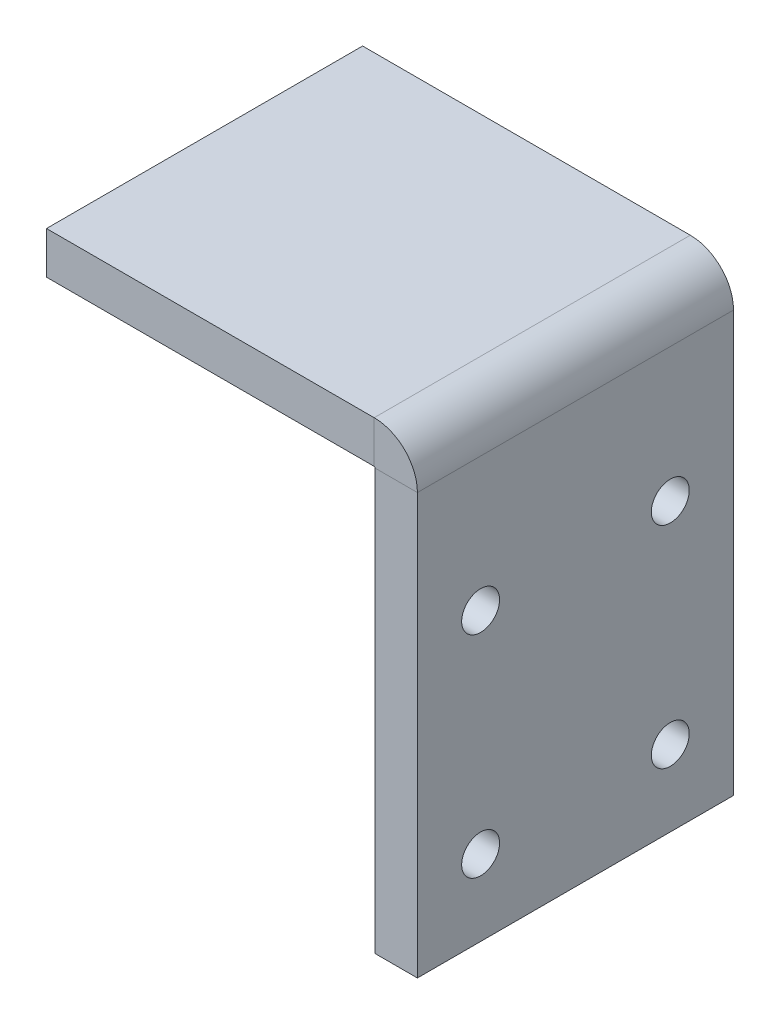
ISO-10303-21;
HEADER;
FILE_DESCRIPTION(('STEP AP214'),'2;1');
FILE_NAME('part.step','',(''),(''),'','','');
FILE_SCHEMA(('AUTOMOTIVE_DESIGN { 1 0 10303 214 1 1 1 1 }'));
ENDSEC;
DATA;
#1=APPLICATION_CONTEXT('core data for automotive mechanical design processes');
#2=APPLICATION_PROTOCOL_DEFINITION('international standard','automotive_design',2000,#1);
#3=PRODUCT_CONTEXT('',#1,'mechanical');
#4=PRODUCT('Part','Part','',(#3));
#5=PRODUCT_RELATED_PRODUCT_CATEGORY('part','',(#4));
#6=PRODUCT_DEFINITION_FORMATION('','',#4);
#7=PRODUCT_DEFINITION_CONTEXT('part definition',#1,'design');
#8=PRODUCT_DEFINITION('design','',#6,#7);
#9=PRODUCT_DEFINITION_SHAPE('','',#8);
#10=(LENGTH_UNIT() NAMED_UNIT(*) SI_UNIT(.MILLI.,.METRE.));
#11=(NAMED_UNIT(*) PLANE_ANGLE_UNIT() SI_UNIT($,.RADIAN.));
#12=(NAMED_UNIT(*) SI_UNIT($,.STERADIAN.) SOLID_ANGLE_UNIT());
#13=UNCERTAINTY_MEASURE_WITH_UNIT(LENGTH_MEASURE(1.E-05),#10,'distance_accuracy_value','');
#14=(GEOMETRIC_REPRESENTATION_CONTEXT(3) GLOBAL_UNCERTAINTY_ASSIGNED_CONTEXT((#13)) GLOBAL_UNIT_ASSIGNED_CONTEXT((#10,
#11,#12)) REPRESENTATION_CONTEXT('',''));
#15=CARTESIAN_POINT('',(0.,0.,0.));
#16=DIRECTION('',(0.,0.,1.));
#17=DIRECTION('',(1.,0.,0.));
#18=AXIS2_PLACEMENT_3D('',#15,#16,#17);
#19=CARTESIAN_POINT('',(-0.249999999999972,100.,75.));
#20=DIRECTION('',(0.,0.,1.));
#21=DIRECTION('',(1.,0.,0.));
#22=AXIS2_PLACEMENT_3D('',#19,#20,#21);
#23=PLANE('',#22);
#24=DIRECTION('',(0.,1.,0.));
#25=VECTOR('',#24,1.);
#26=CARTESIAN_POINT('',(-0.249999999999972,100.,75.));
#27=LINE('',#26,#25);
#28=CARTESIAN_POINT('',(-0.249999999999972,100.,75.));
#29=VERTEX_POINT('',#28);
#30=CARTESIAN_POINT('',(-0.250000000000028,110.,75.));
#31=VERTEX_POINT('',#30);
#32=EDGE_CURVE('E13',#29,#31,#27,.T.);
#33=ORIENTED_EDGE('',*,*,#32,.F.);
#34=CARTESIAN_POINT('',(-0.249999999999972,99.7499999999999,75.));
#35=DIRECTION('',(0.,0.,-1.));
#36=DIRECTION('',(-1.,0.,0.));
#37=AXIS2_PLACEMENT_3D('',#34,#35,#36);
#38=CIRCLE('',#37,0.25);
#39=CARTESIAN_POINT('',(0.,99.7499999999999,75.));
#40=VERTEX_POINT('',#39);
#41=EDGE_CURVE('E147',#40,#29,#38,.F.);
#42=ORIENTED_EDGE('',*,*,#41,.F.);
#43=DIRECTION('',(-1.,0.,0.));
#44=VECTOR('',#43,1.);
#45=CARTESIAN_POINT('',(10.,99.7499999999999,75.));
#46=LINE('',#45,#44);
#47=CARTESIAN_POINT('',(10.,99.7499999999999,75.));
#48=VERTEX_POINT('',#47);
#49=EDGE_CURVE('E58',#48,#40,#46,.T.);
#50=ORIENTED_EDGE('',*,*,#49,.F.);
#51=CARTESIAN_POINT('',(-0.249999999999972,99.7499999999999,75.));
#52=DIRECTION('',(0.,0.,1.));
#53=DIRECTION('',(1.,0.,0.));
#54=AXIS2_PLACEMENT_3D('',#51,#52,#53);
#55=CIRCLE('',#54,10.25);
#56=EDGE_CURVE('E140',#48,#31,#55,.T.);
#57=ORIENTED_EDGE('',*,*,#56,.T.);
#58=EDGE_LOOP('',(#33,#42,#50,#57));
#59=FACE_BOUND('',#58,.T.);
#60=ADVANCED_FACE('F50',(#59),#23,.T.);
#61=CARTESIAN_POINT('',(10.,99.7499999999999,75.));
#62=DIRECTION('',(0.,0.,1.));
#63=DIRECTION('',(1.,0.,0.));
#64=AXIS2_PLACEMENT_3D('',#61,#62,#63);
#65=PLANE('',#64);
#66=DIRECTION('',(-1.,0.,0.));
#67=VECTOR('',#66,1.);
#68=CARTESIAN_POINT('',(0.,100.,75.));
#69=LINE('',#68,#67);
#70=CARTESIAN_POINT('',(-78.,99.9999999999998,75.));
#71=VERTEX_POINT('',#70);
#72=EDGE_CURVE('E197',#29,#71,#69,.T.);
#73=ORIENTED_EDGE('',*,*,#72,.F.);
#74=ORIENTED_EDGE('',*,*,#32,.T.);
#75=DIRECTION('',(-1.,0.,0.));
#76=VECTOR('',#75,1.);
#77=CARTESIAN_POINT('',(0.,110.,75.));
#78=LINE('',#77,#76);
#79=CARTESIAN_POINT('',(-78.,110.,75.));
#80=VERTEX_POINT('',#79);
#81=EDGE_CURVE('E106',#31,#80,#78,.T.);
#82=ORIENTED_EDGE('',*,*,#81,.T.);
#83=DIRECTION('',(0.,1.,0.));
#84=VECTOR('',#83,1.);
#85=CARTESIAN_POINT('',(-78.,99.9999999999998,75.));
#86=LINE('',#85,#84);
#87=EDGE_CURVE('E391',#71,#80,#86,.T.);
#88=ORIENTED_EDGE('',*,*,#87,.F.);
#89=EDGE_LOOP('',(#73,#74,#82,#88));
#90=FACE_BOUND('',#89,.T.);
#91=ADVANCED_FACE('F205',(#90),#65,.T.);
#92=CARTESIAN_POINT('',(0.,99.7499999999999,0.));
#93=DIRECTION('',(0.,0.,-1.));
#94=DIRECTION('',(-1.,0.,0.));
#95=AXIS2_PLACEMENT_3D('',#92,#93,#94);
#96=PLANE('',#95);
#97=DIRECTION('',(1.,0.,0.));
#98=VECTOR('',#97,1.);
#99=CARTESIAN_POINT('',(0.,99.7499999999999,0.));
#100=LINE('',#99,#98);
#101=CARTESIAN_POINT('',(0.,99.7499999999999,0.));
#102=VERTEX_POINT('',#101);
#103=CARTESIAN_POINT('',(10.,99.7499999999999,0.));
#104=VERTEX_POINT('',#103);
#105=EDGE_CURVE('E93',#102,#104,#100,.T.);
#106=ORIENTED_EDGE('',*,*,#105,.F.);
#107=CARTESIAN_POINT('',(-0.249999999999972,99.7499999999999,0.));
#108=DIRECTION('',(0.,0.,-1.));
#109=DIRECTION('',(-1.,0.,0.));
#110=AXIS2_PLACEMENT_3D('',#107,#108,#109);
#111=CIRCLE('',#110,0.25);
#112=CARTESIAN_POINT('',(-0.249999999999972,100.,0.));
#113=VERTEX_POINT('',#112);
#114=EDGE_CURVE('E163',#102,#113,#111,.F.);
#115=ORIENTED_EDGE('',*,*,#114,.T.);
#116=DIRECTION('',(0.,-1.,0.));
#117=VECTOR('',#116,1.);
#118=CARTESIAN_POINT('',(-0.250000000000028,110.,0.));
#119=LINE('',#118,#117);
#120=CARTESIAN_POINT('',(-0.250000000000028,110.,0.));
#121=VERTEX_POINT('',#120);
#122=EDGE_CURVE('E100',#121,#113,#119,.T.);
#123=ORIENTED_EDGE('',*,*,#122,.F.);
#124=CARTESIAN_POINT('',(-0.249999999999972,99.7499999999999,0.));
#125=DIRECTION('',(0.,0.,1.));
#126=DIRECTION('',(1.,0.,0.));
#127=AXIS2_PLACEMENT_3D('',#124,#125,#126);
#128=CIRCLE('',#127,10.25);
#129=EDGE_CURVE('E170',#104,#121,#128,.T.);
#130=ORIENTED_EDGE('',*,*,#129,.F.);
#131=EDGE_LOOP('',(#106,#115,#123,#130));
#132=FACE_BOUND('',#131,.T.);
#133=ADVANCED_FACE('F203',(#132),#96,.T.);
#134=CARTESIAN_POINT('',(-0.250000000000028,110.,0.));
#135=DIRECTION('',(0.,0.,-1.));
#136=DIRECTION('',(-1.,0.,0.));
#137=AXIS2_PLACEMENT_3D('',#134,#135,#136);
#138=PLANE('',#137);
#139=DIRECTION('',(0.,1.,0.));
#140=VECTOR('',#139,1.);
#141=CARTESIAN_POINT('',(0.,0.,0.));
#142=LINE('',#141,#140);
#143=CARTESIAN_POINT('',(0.,0.,0.));
#144=VERTEX_POINT('',#143);
#145=EDGE_CURVE('E165',#144,#102,#142,.T.);
#146=ORIENTED_EDGE('',*,*,#145,.T.);
#147=ORIENTED_EDGE('',*,*,#105,.T.);
#148=DIRECTION('',(0.,1.,0.));
#149=VECTOR('',#148,1.);
#150=CARTESIAN_POINT('',(10.,0.,0.));
#151=LINE('',#150,#149);
#152=CARTESIAN_POINT('',(10.,0.,0.));
#153=VERTEX_POINT('',#152);
#154=EDGE_CURVE('E168',#153,#104,#151,.T.);
#155=ORIENTED_EDGE('',*,*,#154,.F.);
#156=DIRECTION('',(-1.,0.,0.));
#157=VECTOR('',#156,1.);
#158=CARTESIAN_POINT('',(10.,0.,0.));
#159=LINE('',#158,#157);
#160=EDGE_CURVE('E128',#153,#144,#159,.T.);
#161=ORIENTED_EDGE('',*,*,#160,.T.);
#162=EDGE_LOOP('',(#146,#147,#155,#161));
#163=FACE_BOUND('',#162,.T.);
#164=ADVANCED_FACE('F199',(#163),#138,.T.);
#165=CARTESIAN_POINT('',(0.,110.,75.));
#166=DIRECTION('',(0.,-1.,0.));
#167=DIRECTION('',(1.,0.,0.));
#168=AXIS2_PLACEMENT_3D('',#165,#166,#167);
#169=PLANE('',#168);
#170=DIRECTION('',(-1.,0.,0.));
#171=VECTOR('',#170,1.);
#172=CARTESIAN_POINT('',(0.,110.,0.));
#173=LINE('',#172,#171);
#174=CARTESIAN_POINT('',(-78.,110.,0.));
#175=VERTEX_POINT('',#174);
#176=EDGE_CURVE('E153',#121,#175,#173,.T.);
#177=ORIENTED_EDGE('',*,*,#176,.T.);
#178=DIRECTION('',(0.,0.,-1.));
#179=VECTOR('',#178,1.);
#180=CARTESIAN_POINT('',(-78.,110.,75.));
#181=LINE('',#180,#179);
#182=EDGE_CURVE('E184',#80,#175,#181,.T.);
#183=ORIENTED_EDGE('',*,*,#182,.F.);
#184=ORIENTED_EDGE('',*,*,#81,.F.);
#185=DIRECTION('',(0.,0.,-1.));
#186=VECTOR('',#185,1.);
#187=CARTESIAN_POINT('',(-0.250000000000028,110.,75.));
#188=LINE('',#187,#186);
#189=EDGE_CURVE('E152',#31,#121,#188,.T.);
#190=ORIENTED_EDGE('',*,*,#189,.T.);
#191=EDGE_LOOP('',(#177,#183,#184,#190));
#192=FACE_BOUND('',#191,.T.);
#193=ADVANCED_FACE('F211',(#192),#169,.F.);
#194=CARTESIAN_POINT('',(-78.,99.9999999999998,75.));
#195=DIRECTION('',(-1.,0.,0.));
#196=DIRECTION('',(0.,0.,1.));
#197=AXIS2_PLACEMENT_3D('',#194,#195,#196);
#198=PLANE('',#197);
#199=DIRECTION('',(0.,1.,0.));
#200=VECTOR('',#199,1.);
#201=CARTESIAN_POINT('',(-78.,99.9999999999998,0.));
#202=LINE('',#201,#200);
#203=CARTESIAN_POINT('',(-78.,99.9999999999998,0.));
#204=VERTEX_POINT('',#203);
#205=EDGE_CURVE('E156',#204,#175,#202,.T.);
#206=ORIENTED_EDGE('',*,*,#205,.F.);
#207=DIRECTION('',(0.,0.,-1.));
#208=VECTOR('',#207,1.);
#209=CARTESIAN_POINT('',(-78.,99.9999999999998,75.));
#210=LINE('',#209,#208);
#211=EDGE_CURVE('E182',#71,#204,#210,.T.);
#212=ORIENTED_EDGE('',*,*,#211,.F.);
#213=ORIENTED_EDGE('',*,*,#87,.T.);
#214=ORIENTED_EDGE('',*,*,#182,.T.);
#215=EDGE_LOOP('',(#206,#212,#213,#214));
#216=FACE_BOUND('',#215,.T.);
#217=ADVANCED_FACE('F242',(#216),#198,.T.);
#218=CARTESIAN_POINT('',(0.,100.,75.));
#219=DIRECTION('',(0.,-1.,0.));
#220=DIRECTION('',(1.,0.,0.));
#221=AXIS2_PLACEMENT_3D('',#218,#219,#220);
#222=PLANE('',#221);
#223=DIRECTION('',(-1.,0.,0.));
#224=VECTOR('',#223,1.);
#225=CARTESIAN_POINT('',(0.,100.,0.));
#226=LINE('',#225,#224);
#227=EDGE_CURVE('E160',#113,#204,#226,.T.);
#228=ORIENTED_EDGE('',*,*,#227,.F.);
#229=DIRECTION('',(0.,0.,-1.));
#230=VECTOR('',#229,1.);
#231=CARTESIAN_POINT('',(-0.249999999999972,100.,75.));
#232=LINE('',#231,#230);
#233=EDGE_CURVE('E179',#29,#113,#232,.T.);
#234=ORIENTED_EDGE('',*,*,#233,.F.);
#235=ORIENTED_EDGE('',*,*,#72,.T.);
#236=ORIENTED_EDGE('',*,*,#211,.T.);
#237=EDGE_LOOP('',(#228,#234,#235,#236));
#238=FACE_BOUND('',#237,.T.);
#239=ADVANCED_FACE('F252',(#238),#222,.T.);
#240=CARTESIAN_POINT('',(-0.249999999999972,99.7499999999999,75.));
#241=DIRECTION('',(0.,0.,-1.));
#242=DIRECTION('',(-1.,0.,0.));
#243=AXIS2_PLACEMENT_3D('',#240,#241,#242);
#244=CYLINDRICAL_SURFACE('',#243,0.25);
#245=ORIENTED_EDGE('',*,*,#114,.F.);
#246=DIRECTION('',(0.,0.,-1.));
#247=VECTOR('',#246,1.);
#248=CARTESIAN_POINT('',(0.,99.7499999999999,75.));
#249=LINE('',#248,#247);
#250=EDGE_CURVE('E176',#40,#102,#249,.T.);
#251=ORIENTED_EDGE('',*,*,#250,.F.);
#252=ORIENTED_EDGE('',*,*,#41,.T.);
#253=ORIENTED_EDGE('',*,*,#233,.T.);
#254=EDGE_LOOP('',(#245,#251,#252,#253));
#255=FACE_BOUND('',#254,.T.);
#256=ADVANCED_FACE('F193',(#255),#244,.F.);
#257=CARTESIAN_POINT('',(0.,0.,75.));
#258=DIRECTION('',(-1.,0.,0.));
#259=DIRECTION('',(0.,0.,1.));
#260=AXIS2_PLACEMENT_3D('',#257,#258,#259);
#261=PLANE('',#260);
#262=CARTESIAN_POINT('',(0.,18.,15.));
#263=DIRECTION('',(-1.,0.,0.));
#264=DIRECTION('',(0.,0.,1.));
#265=AXIS2_PLACEMENT_3D('',#262,#263,#264);
#266=CIRCLE('',#265,4.5);
#267=CARTESIAN_POINT('',(0.,18.,19.5));
#268=VERTEX_POINT('',#267);
#269=EDGE_CURVE('E157',#268,#268,#266,.T.);
#270=ORIENTED_EDGE('',*,*,#269,.F.);
#271=EDGE_LOOP('',(#270));
#272=FACE_BOUND('',#271,.T.);
#273=CARTESIAN_POINT('',(0.,68.0000000000001,60.));
#274=DIRECTION('',(-1.,0.,0.));
#275=DIRECTION('',(0.,0.,1.));
#276=AXIS2_PLACEMENT_3D('',#273,#274,#275);
#277=CIRCLE('',#276,4.5);
#278=CARTESIAN_POINT('',(0.,68.0000000000001,64.5));
#279=VERTEX_POINT('',#278);
#280=EDGE_CURVE('E386',#279,#279,#277,.T.);
#281=ORIENTED_EDGE('',*,*,#280,.F.);
#282=EDGE_LOOP('',(#281));
#283=FACE_BOUND('',#282,.T.);
#284=CARTESIAN_POINT('',(0.,68.0000000000001,15.));
#285=DIRECTION('',(-1.,0.,0.));
#286=DIRECTION('',(0.,0.,1.));
#287=AXIS2_PLACEMENT_3D('',#284,#285,#286);
#288=CIRCLE('',#287,4.50000000000001);
#289=CARTESIAN_POINT('',(0.,68.0000000000001,19.5));
#290=VERTEX_POINT('',#289);
#291=EDGE_CURVE('E383',#290,#290,#288,.T.);
#292=ORIENTED_EDGE('',*,*,#291,.F.);
#293=EDGE_LOOP('',(#292));
#294=FACE_BOUND('',#293,.T.);
#295=CARTESIAN_POINT('',(0.,18.,60.));
#296=DIRECTION('',(-1.,0.,0.));
#297=DIRECTION('',(0.,0.,1.));
#298=AXIS2_PLACEMENT_3D('',#295,#296,#297);
#299=CIRCLE('',#298,4.5);
#300=CARTESIAN_POINT('',(0.,18.,64.5));
#301=VERTEX_POINT('',#300);
#302=EDGE_CURVE('E374',#301,#301,#299,.T.);
#303=ORIENTED_EDGE('',*,*,#302,.F.);
#304=EDGE_LOOP('',(#303));
#305=FACE_BOUND('',#304,.T.);
#306=ORIENTED_EDGE('',*,*,#145,.F.);
#307=DIRECTION('',(0.,0.,-1.));
#308=VECTOR('',#307,1.);
#309=CARTESIAN_POINT('',(0.,0.,75.));
#310=LINE('',#309,#308);
#311=CARTESIAN_POINT('',(0.,0.,75.));
#312=VERTEX_POINT('',#311);
#313=EDGE_CURVE('E130',#312,#144,#310,.T.);
#314=ORIENTED_EDGE('',*,*,#313,.F.);
#315=DIRECTION('',(0.,1.,0.));
#316=VECTOR('',#315,1.);
#317=CARTESIAN_POINT('',(0.,0.,75.));
#318=LINE('',#317,#316);
#319=EDGE_CURVE('E145',#312,#40,#318,.T.);
#320=ORIENTED_EDGE('',*,*,#319,.T.);
#321=ORIENTED_EDGE('',*,*,#250,.T.);
#322=EDGE_LOOP('',(#306,#314,#320,#321));
#323=FACE_BOUND('',#322,.T.);
#324=ADVANCED_FACE('F198',(#272,#283,#294,#305,#323),#261,.T.);
#325=CARTESIAN_POINT('',(10.,0.,75.));
#326=DIRECTION('',(0.,-1.,0.));
#327=DIRECTION('',(0.,0.,-1.));
#328=AXIS2_PLACEMENT_3D('',#325,#326,#327);
#329=PLANE('',#328);
#330=ORIENTED_EDGE('',*,*,#160,.F.);
#331=DIRECTION('',(0.,0.,-1.));
#332=VECTOR('',#331,1.);
#333=CARTESIAN_POINT('',(10.,0.,75.));
#334=LINE('',#333,#332);
#335=CARTESIAN_POINT('',(10.,0.,75.));
#336=VERTEX_POINT('',#335);
#337=EDGE_CURVE('E122',#336,#153,#334,.T.);
#338=ORIENTED_EDGE('',*,*,#337,.F.);
#339=DIRECTION('',(-1.,0.,0.));
#340=VECTOR('',#339,1.);
#341=CARTESIAN_POINT('',(10.,0.,75.));
#342=LINE('',#341,#340);
#343=EDGE_CURVE('E126',#336,#312,#342,.T.);
#344=ORIENTED_EDGE('',*,*,#343,.T.);
#345=ORIENTED_EDGE('',*,*,#313,.T.);
#346=EDGE_LOOP('',(#330,#338,#344,#345));
#347=FACE_BOUND('',#346,.T.);
#348=ADVANCED_FACE('F124',(#347),#329,.T.);
#349=CARTESIAN_POINT('',(10.,0.,75.));
#350=DIRECTION('',(-1.,0.,0.));
#351=DIRECTION('',(0.,0.,1.));
#352=AXIS2_PLACEMENT_3D('',#349,#350,#351);
#353=PLANE('',#352);
#354=CARTESIAN_POINT('',(10.,18.,15.));
#355=DIRECTION('',(1.,0.,0.));
#356=DIRECTION('',(0.,0.,-1.));
#357=AXIS2_PLACEMENT_3D('',#354,#355,#356);
#358=CIRCLE('',#357,4.5);
#359=CARTESIAN_POINT('',(10.,18.,10.5));
#360=VERTEX_POINT('',#359);
#361=EDGE_CURVE('E369',#360,#360,#358,.T.);
#362=ORIENTED_EDGE('',*,*,#361,.F.);
#363=EDGE_LOOP('',(#362));
#364=FACE_BOUND('',#363,.T.);
#365=CARTESIAN_POINT('',(10.,68.0000000000001,60.));
#366=DIRECTION('',(1.,0.,0.));
#367=DIRECTION('',(0.,0.,-1.));
#368=AXIS2_PLACEMENT_3D('',#365,#366,#367);
#369=CIRCLE('',#368,4.5);
#370=CARTESIAN_POINT('',(10.,68.0000000000001,55.5));
#371=VERTEX_POINT('',#370);
#372=EDGE_CURVE('E371',#371,#371,#369,.T.);
#373=ORIENTED_EDGE('',*,*,#372,.F.);
#374=EDGE_LOOP('',(#373));
#375=FACE_BOUND('',#374,.T.);
#376=CARTESIAN_POINT('',(10.,68.0000000000001,15.));
#377=DIRECTION('',(1.,0.,0.));
#378=DIRECTION('',(0.,0.,-1.));
#379=AXIS2_PLACEMENT_3D('',#376,#377,#378);
#380=CIRCLE('',#379,4.50000000000001);
#381=CARTESIAN_POINT('',(10.,68.0000000000001,10.5));
#382=VERTEX_POINT('',#381);
#383=EDGE_CURVE('E377',#382,#382,#380,.T.);
#384=ORIENTED_EDGE('',*,*,#383,.F.);
#385=EDGE_LOOP('',(#384));
#386=FACE_BOUND('',#385,.T.);
#387=CARTESIAN_POINT('',(10.,18.,60.));
#388=DIRECTION('',(1.,0.,0.));
#389=DIRECTION('',(0.,0.,-1.));
#390=AXIS2_PLACEMENT_3D('',#387,#388,#389);
#391=CIRCLE('',#390,4.5);
#392=CARTESIAN_POINT('',(10.,18.,55.5));
#393=VERTEX_POINT('',#392);
#394=EDGE_CURVE('E370',#393,#393,#391,.T.);
#395=ORIENTED_EDGE('',*,*,#394,.F.);
#396=EDGE_LOOP('',(#395));
#397=FACE_BOUND('',#396,.T.);
#398=ORIENTED_EDGE('',*,*,#154,.T.);
#399=DIRECTION('',(0.,0.,-1.));
#400=VECTOR('',#399,1.);
#401=CARTESIAN_POINT('',(10.,99.7499999999999,75.));
#402=LINE('',#401,#400);
#403=EDGE_CURVE('E131',#48,#104,#402,.T.);
#404=ORIENTED_EDGE('',*,*,#403,.F.);
#405=DIRECTION('',(0.,1.,0.));
#406=VECTOR('',#405,1.);
#407=CARTESIAN_POINT('',(10.,0.,75.));
#408=LINE('',#407,#406);
#409=EDGE_CURVE('E135',#336,#48,#408,.T.);
#410=ORIENTED_EDGE('',*,*,#409,.F.);
#411=ORIENTED_EDGE('',*,*,#337,.T.);
#412=EDGE_LOOP('',(#398,#404,#410,#411));
#413=FACE_BOUND('',#412,.T.);
#414=ADVANCED_FACE('F136',(#364,#375,#386,#397,#413),#353,.F.);
#415=CARTESIAN_POINT('',(-0.249999999999972,99.7499999999999,75.));
#416=DIRECTION('',(0.,0.,-1.));
#417=DIRECTION('',(-1.,0.,0.));
#418=AXIS2_PLACEMENT_3D('',#415,#416,#417);
#419=CYLINDRICAL_SURFACE('',#418,10.25);
#420=ORIENTED_EDGE('',*,*,#129,.T.);
#421=ORIENTED_EDGE('',*,*,#189,.F.);
#422=ORIENTED_EDGE('',*,*,#56,.F.);
#423=ORIENTED_EDGE('',*,*,#403,.T.);
#424=EDGE_LOOP('',(#420,#421,#422,#423));
#425=FACE_BOUND('',#424,.T.);
#426=ADVANCED_FACE('F201',(#425),#419,.T.);
#427=CARTESIAN_POINT('',(-0.249999999999972,99.7499999999999,75.));
#428=DIRECTION('',(0.,0.,-1.));
#429=DIRECTION('',(-1.,0.,0.));
#430=AXIS2_PLACEMENT_3D('',#427,#428,#429);
#431=PLANE('',#430);
#432=ORIENTED_EDGE('',*,*,#409,.T.);
#433=ORIENTED_EDGE('',*,*,#49,.T.);
#434=ORIENTED_EDGE('',*,*,#319,.F.);
#435=ORIENTED_EDGE('',*,*,#343,.F.);
#436=EDGE_LOOP('',(#432,#433,#434,#435));
#437=FACE_BOUND('',#436,.T.);
#438=ADVANCED_FACE('F143',(#437),#431,.F.);
#439=CARTESIAN_POINT('',(-0.249999999999972,99.7499999999999,0.));
#440=DIRECTION('',(0.,0.,-1.));
#441=DIRECTION('',(-1.,0.,0.));
#442=AXIS2_PLACEMENT_3D('',#439,#440,#441);
#443=PLANE('',#442);
#444=ORIENTED_EDGE('',*,*,#176,.F.);
#445=ORIENTED_EDGE('',*,*,#122,.T.);
#446=ORIENTED_EDGE('',*,*,#227,.T.);
#447=ORIENTED_EDGE('',*,*,#205,.T.);
#448=EDGE_LOOP('',(#444,#445,#446,#447));
#449=FACE_BOUND('',#448,.T.);
#450=ADVANCED_FACE('F313',(#449),#443,.T.);
#451=CARTESIAN_POINT('',(-78.,18.,60.));
#452=DIRECTION('',(1.,0.,0.));
#453=DIRECTION('',(0.,0.,-1.));
#454=AXIS2_PLACEMENT_3D('',#451,#452,#453);
#455=CYLINDRICAL_SURFACE('',#454,4.5);
#456=ORIENTED_EDGE('',*,*,#302,.T.);
#457=EDGE_LOOP('',(#456));
#458=FACE_BOUND('',#457,.T.);
#459=ORIENTED_EDGE('',*,*,#394,.T.);
#460=EDGE_LOOP('',(#459));
#461=FACE_BOUND('',#460,.T.);
#462=ADVANCED_FACE('F321',(#458,#461),#455,.F.);
#463=CARTESIAN_POINT('',(-78.,68.0000000000001,15.));
#464=DIRECTION('',(1.,0.,0.));
#465=DIRECTION('',(0.,0.,-1.));
#466=AXIS2_PLACEMENT_3D('',#463,#464,#465);
#467=CYLINDRICAL_SURFACE('',#466,4.50000000000001);
#468=ORIENTED_EDGE('',*,*,#291,.T.);
#469=EDGE_LOOP('',(#468));
#470=FACE_BOUND('',#469,.T.);
#471=ORIENTED_EDGE('',*,*,#383,.T.);
#472=EDGE_LOOP('',(#471));
#473=FACE_BOUND('',#472,.T.);
#474=ADVANCED_FACE('F331',(#470,#473),#467,.F.);
#475=CARTESIAN_POINT('',(-78.,68.0000000000001,60.));
#476=DIRECTION('',(1.,0.,0.));
#477=DIRECTION('',(0.,0.,-1.));
#478=AXIS2_PLACEMENT_3D('',#475,#476,#477);
#479=CYLINDRICAL_SURFACE('',#478,4.5);
#480=ORIENTED_EDGE('',*,*,#280,.T.);
#481=EDGE_LOOP('',(#480));
#482=FACE_BOUND('',#481,.T.);
#483=ORIENTED_EDGE('',*,*,#372,.T.);
#484=EDGE_LOOP('',(#483));
#485=FACE_BOUND('',#484,.T.);
#486=ADVANCED_FACE('F341',(#482,#485),#479,.F.);
#487=CARTESIAN_POINT('',(-78.,18.,15.));
#488=DIRECTION('',(1.,0.,0.));
#489=DIRECTION('',(0.,0.,-1.));
#490=AXIS2_PLACEMENT_3D('',#487,#488,#489);
#491=CYLINDRICAL_SURFACE('',#490,4.5);
#492=ORIENTED_EDGE('',*,*,#269,.T.);
#493=EDGE_LOOP('',(#492));
#494=FACE_BOUND('',#493,.T.);
#495=ORIENTED_EDGE('',*,*,#361,.T.);
#496=EDGE_LOOP('',(#495));
#497=FACE_BOUND('',#496,.T.);
#498=ADVANCED_FACE('F351',(#494,#497),#491,.F.);
#499=CLOSED_SHELL('',(#60,#91,#133,#164,#193,#217,#239,#256,#324,#348,#414,#426,#438,#450,#462,
#474,#486,#498));
#500=MANIFOLD_SOLID_BREP('B2',#499);
#501=ADVANCED_BREP_SHAPE_REPRESENTATION('',(#18,#500),#14);
#502=SHAPE_DEFINITION_REPRESENTATION(#9,#501);
ENDSEC;
END-ISO-10303-21;
